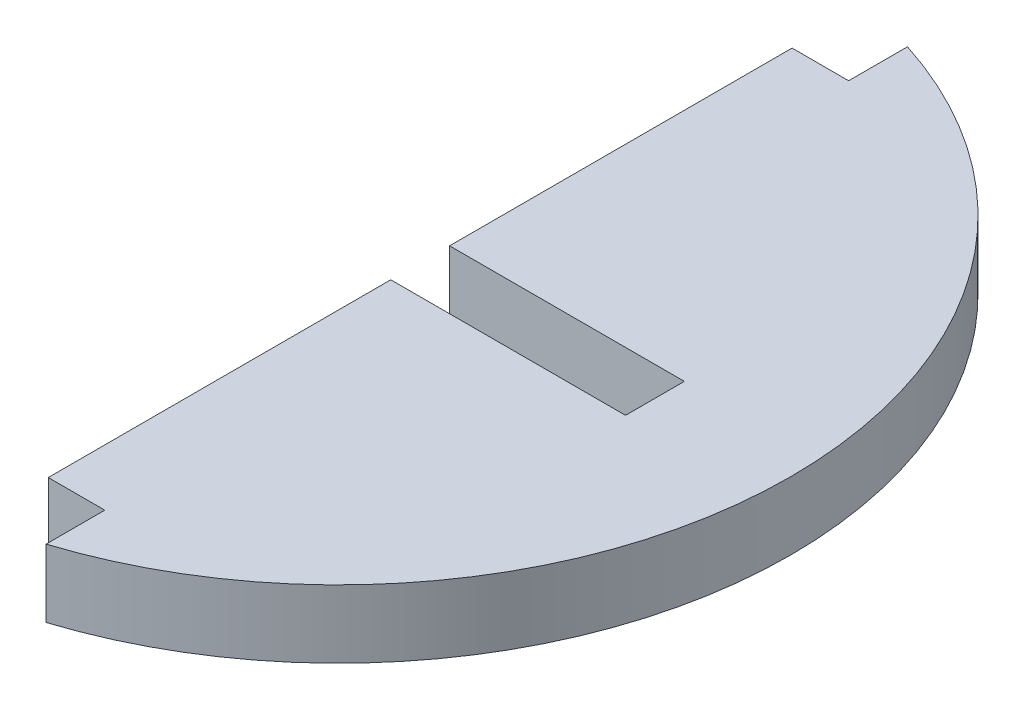
ISO-10303-21;
HEADER;
FILE_DESCRIPTION(('STEP AP214'),'2;1');
FILE_NAME('part.step','',(''),(''),'','','');
FILE_SCHEMA(('AUTOMOTIVE_DESIGN { 1 0 10303 214 1 1 1 1 }'));
ENDSEC;
DATA;
#1=APPLICATION_CONTEXT('core data for automotive mechanical design processes');
#2=APPLICATION_PROTOCOL_DEFINITION('international standard','automotive_design',2000,#1);
#3=PRODUCT_CONTEXT('',#1,'mechanical');
#4=PRODUCT('Part','Part','',(#3));
#5=PRODUCT_RELATED_PRODUCT_CATEGORY('part','',(#4));
#6=PRODUCT_DEFINITION_FORMATION('','',#4);
#7=PRODUCT_DEFINITION_CONTEXT('part definition',#1,'design');
#8=PRODUCT_DEFINITION('design','',#6,#7);
#9=PRODUCT_DEFINITION_SHAPE('','',#8);
#10=(LENGTH_UNIT() NAMED_UNIT(*) SI_UNIT(.MILLI.,.METRE.));
#11=(NAMED_UNIT(*) PLANE_ANGLE_UNIT() SI_UNIT($,.RADIAN.));
#12=(NAMED_UNIT(*) SI_UNIT($,.STERADIAN.) SOLID_ANGLE_UNIT());
#13=UNCERTAINTY_MEASURE_WITH_UNIT(LENGTH_MEASURE(1.E-05),#10,'distance_accuracy_value','');
#14=(GEOMETRIC_REPRESENTATION_CONTEXT(3) GLOBAL_UNCERTAINTY_ASSIGNED_CONTEXT((#13)) GLOBAL_UNIT_ASSIGNED_CONTEXT((#10,
#11,#12)) REPRESENTATION_CONTEXT('',''));
#15=CARTESIAN_POINT('',(0.,0.,0.));
#16=DIRECTION('',(0.,0.,1.));
#17=DIRECTION('',(1.,0.,0.));
#18=AXIS2_PLACEMENT_3D('',#15,#16,#17);
#19=CARTESIAN_POINT('',(14.,-1.5,1.3));
#20=DIRECTION('',(-1.,0.,0.));
#21=DIRECTION('',(0.,0.,1.));
#22=AXIS2_PLACEMENT_3D('',#19,#20,#21);
#23=PLANE('',#22);
#24=DIRECTION('',(0.,1.,0.));
#25=VECTOR('',#24,1.);
#26=CARTESIAN_POINT('',(14.,-1.5,1.3));
#27=LINE('',#26,#25);
#28=CARTESIAN_POINT('',(14.,-1.5,1.3));
#29=VERTEX_POINT('',#28);
#30=CARTESIAN_POINT('',(14.,1.5,1.3));
#31=VERTEX_POINT('',#30);
#32=EDGE_CURVE('E36',#29,#31,#27,.T.);
#33=ORIENTED_EDGE('',*,*,#32,.T.);
#34=DIRECTION('',(0.,0.,1.));
#35=VECTOR('',#34,1.);
#36=CARTESIAN_POINT('',(14.,1.5,1.3));
#37=LINE('',#36,#35);
#38=CARTESIAN_POINT('',(14.,1.5,-1.3));
#39=VERTEX_POINT('',#38);
#40=EDGE_CURVE('E109',#39,#31,#37,.T.);
#41=ORIENTED_EDGE('',*,*,#40,.F.);
#42=DIRECTION('',(0.,1.,0.));
#43=VECTOR('',#42,1.);
#44=CARTESIAN_POINT('',(14.,-1.5,-1.3));
#45=LINE('',#44,#43);
#46=CARTESIAN_POINT('',(14.,-1.5,-1.3));
#47=VERTEX_POINT('',#46);
#48=EDGE_CURVE('E11',#47,#39,#45,.T.);
#49=ORIENTED_EDGE('',*,*,#48,.F.);
#50=DIRECTION('',(0.,0.,1.));
#51=VECTOR('',#50,1.);
#52=CARTESIAN_POINT('',(14.,-1.5,1.3));
#53=LINE('',#52,#51);
#54=EDGE_CURVE('E110',#47,#29,#53,.T.);
#55=ORIENTED_EDGE('',*,*,#54,.T.);
#56=EDGE_LOOP('',(#33,#41,#49,#55));
#57=FACE_BOUND('',#56,.T.);
#58=ADVANCED_FACE('F33',(#57),#23,.T.);
#59=CARTESIAN_POINT('',(14.,-1.5,-1.3));
#60=DIRECTION('',(0.,0.,1.));
#61=DIRECTION('',(1.,0.,0.));
#62=AXIS2_PLACEMENT_3D('',#59,#60,#61);
#63=PLANE('',#62);
#64=ORIENTED_EDGE('',*,*,#48,.T.);
#65=DIRECTION('',(1.,0.,0.));
#66=VECTOR('',#65,1.);
#67=CARTESIAN_POINT('',(14.,1.5,-1.3));
#68=LINE('',#67,#66);
#69=CARTESIAN_POINT('',(3.62132034355964,1.5,-1.30000000000001));
#70=VERTEX_POINT('',#69);
#71=EDGE_CURVE('E127',#70,#39,#68,.T.);
#72=ORIENTED_EDGE('',*,*,#71,.F.);
#73=DIRECTION('',(0.,1.,0.));
#74=VECTOR('',#73,1.);
#75=CARTESIAN_POINT('',(3.62132034355964,-1.5,-1.30000000000001));
#76=LINE('',#75,#74);
#77=CARTESIAN_POINT('',(3.62132034355964,-1.5,-1.30000000000001));
#78=VERTEX_POINT('',#77);
#79=EDGE_CURVE('E41',#78,#70,#76,.T.);
#80=ORIENTED_EDGE('',*,*,#79,.F.);
#81=DIRECTION('',(1.,0.,0.));
#82=VECTOR('',#81,1.);
#83=CARTESIAN_POINT('',(14.,-1.5,-1.3));
#84=LINE('',#83,#82);
#85=EDGE_CURVE('E115',#78,#47,#84,.T.);
#86=ORIENTED_EDGE('',*,*,#85,.T.);
#87=EDGE_LOOP('',(#64,#72,#80,#86));
#88=FACE_BOUND('',#87,.T.);
#89=ADVANCED_FACE('F215',(#88),#63,.T.);
#90=CARTESIAN_POINT('',(3.62132034355965,-1.5,-16.4402058090642));
#91=DIRECTION('',(-1.,0.,0.));
#92=DIRECTION('',(0.,0.,1.));
#93=AXIS2_PLACEMENT_3D('',#90,#91,#92);
#94=PLANE('',#93);
#95=ORIENTED_EDGE('',*,*,#79,.T.);
#96=DIRECTION('',(0.,0.,1.));
#97=VECTOR('',#96,1.);
#98=CARTESIAN_POINT('',(3.62132034355965,1.5,-16.4402058090642));
#99=LINE('',#98,#97);
#100=CARTESIAN_POINT('',(3.62132034355965,1.5,-16.4402058090642));
#101=VERTEX_POINT('',#100);
#102=EDGE_CURVE('E146',#101,#70,#99,.T.);
#103=ORIENTED_EDGE('',*,*,#102,.F.);
#104=DIRECTION('',(0.,1.,0.));
#105=VECTOR('',#104,1.);
#106=CARTESIAN_POINT('',(3.62132034355965,-1.5,-16.4402058090642));
#107=LINE('',#106,#105);
#108=CARTESIAN_POINT('',(3.62132034355965,-1.5,-16.4402058090642));
#109=VERTEX_POINT('',#108);
#110=EDGE_CURVE('E174',#109,#101,#107,.T.);
#111=ORIENTED_EDGE('',*,*,#110,.F.);
#112=DIRECTION('',(0.,0.,1.));
#113=VECTOR('',#112,1.);
#114=CARTESIAN_POINT('',(3.62132034355965,-1.5,-16.4402058090642));
#115=LINE('',#114,#113);
#116=EDGE_CURVE('E170',#109,#78,#115,.T.);
#117=ORIENTED_EDGE('',*,*,#116,.T.);
#118=EDGE_LOOP('',(#95,#103,#111,#117));
#119=FACE_BOUND('',#118,.T.);
#120=ADVANCED_FACE('F213',(#119),#94,.T.);
#121=CARTESIAN_POINT('',(6.12132034355965,-1.5,-16.4402058090642));
#122=DIRECTION('',(0.,0.,-1.));
#123=DIRECTION('',(-1.,0.,0.));
#124=AXIS2_PLACEMENT_3D('',#121,#122,#123);
#125=PLANE('',#124);
#126=ORIENTED_EDGE('',*,*,#110,.T.);
#127=DIRECTION('',(-1.,0.,0.));
#128=VECTOR('',#127,1.);
#129=CARTESIAN_POINT('',(6.12132034355965,1.5,-16.4402058090642));
#130=LINE('',#129,#128);
#131=CARTESIAN_POINT('',(6.12132034355965,1.5,-16.4402058090642));
#132=VERTEX_POINT('',#131);
#133=EDGE_CURVE('E143',#132,#101,#130,.T.);
#134=ORIENTED_EDGE('',*,*,#133,.F.);
#135=DIRECTION('',(0.,1.,0.));
#136=VECTOR('',#135,1.);
#137=CARTESIAN_POINT('',(6.12132034355965,-1.5,-16.4402058090642));
#138=LINE('',#137,#136);
#139=CARTESIAN_POINT('',(6.12132034355965,-1.5,-16.4402058090642));
#140=VERTEX_POINT('',#139);
#141=EDGE_CURVE('E176',#140,#132,#138,.T.);
#142=ORIENTED_EDGE('',*,*,#141,.F.);
#143=DIRECTION('',(-1.,0.,0.));
#144=VECTOR('',#143,1.);
#145=CARTESIAN_POINT('',(6.12132034355965,-1.5,-16.4402058090642));
#146=LINE('',#145,#144);
#147=EDGE_CURVE('E167',#140,#109,#146,.T.);
#148=ORIENTED_EDGE('',*,*,#147,.T.);
#149=EDGE_LOOP('',(#126,#134,#142,#148));
#150=FACE_BOUND('',#149,.T.);
#151=ADVANCED_FACE('F209',(#150),#125,.T.);
#152=CARTESIAN_POINT('',(6.12132034355965,-1.5,-19.0402058090642));
#153=DIRECTION('',(-1.,0.,0.));
#154=DIRECTION('',(0.,0.,1.));
#155=AXIS2_PLACEMENT_3D('',#152,#153,#154);
#156=PLANE('',#155);
#157=ORIENTED_EDGE('',*,*,#141,.T.);
#158=DIRECTION('',(0.,0.,1.));
#159=VECTOR('',#158,1.);
#160=CARTESIAN_POINT('',(6.12132034355965,1.5,-19.0402058090642));
#161=LINE('',#160,#159);
#162=CARTESIAN_POINT('',(6.12132034355965,1.5,-19.0402058090642));
#163=VERTEX_POINT('',#162);
#164=EDGE_CURVE('E140',#163,#132,#161,.T.);
#165=ORIENTED_EDGE('',*,*,#164,.F.);
#166=DIRECTION('',(0.,1.,0.));
#167=VECTOR('',#166,1.);
#168=CARTESIAN_POINT('',(6.12132034355965,-1.5,-19.0402058090642));
#169=LINE('',#168,#167);
#170=CARTESIAN_POINT('',(6.12132034355965,-1.5,-19.0402058090642));
#171=VERTEX_POINT('',#170);
#172=EDGE_CURVE('E178',#171,#163,#169,.T.);
#173=ORIENTED_EDGE('',*,*,#172,.F.);
#174=DIRECTION('',(0.,0.,1.));
#175=VECTOR('',#174,1.);
#176=CARTESIAN_POINT('',(6.12132034355965,-1.5,-19.0402058090642));
#177=LINE('',#176,#175);
#178=EDGE_CURVE('E164',#171,#140,#177,.T.);
#179=ORIENTED_EDGE('',*,*,#178,.T.);
#180=EDGE_LOOP('',(#157,#165,#173,#179));
#181=FACE_BOUND('',#180,.T.);
#182=ADVANCED_FACE('F207',(#181),#156,.T.);
#183=CARTESIAN_POINT('',(0.,-1.5,0.));
#184=DIRECTION('',(0.,1.,0.));
#185=DIRECTION('',(0.,0.,1.));
#186=AXIS2_PLACEMENT_3D('',#183,#184,#185);
#187=CYLINDRICAL_SURFACE('',#186,20.);
#188=ORIENTED_EDGE('',*,*,#172,.T.);
#189=CARTESIAN_POINT('',(0.,1.5,0.));
#190=DIRECTION('',(0.,1.,0.));
#191=DIRECTION('',(0.,0.,1.));
#192=AXIS2_PLACEMENT_3D('',#189,#190,#191);
#193=CIRCLE('',#192,20.);
#194=CARTESIAN_POINT('',(6.12132034355965,1.5,19.0402058090642));
#195=VERTEX_POINT('',#194);
#196=EDGE_CURVE('E137',#195,#163,#193,.T.);
#197=ORIENTED_EDGE('',*,*,#196,.F.);
#198=DIRECTION('',(0.,1.,0.));
#199=VECTOR('',#198,1.);
#200=CARTESIAN_POINT('',(6.12132034355965,-1.5,19.0402058090642));
#201=LINE('',#200,#199);
#202=CARTESIAN_POINT('',(6.12132034355965,-1.5,19.0402058090642));
#203=VERTEX_POINT('',#202);
#204=EDGE_CURVE('E180',#203,#195,#201,.T.);
#205=ORIENTED_EDGE('',*,*,#204,.F.);
#206=CARTESIAN_POINT('',(0.,-1.5,0.));
#207=DIRECTION('',(0.,1.,0.));
#208=DIRECTION('',(0.,0.,1.));
#209=AXIS2_PLACEMENT_3D('',#206,#207,#208);
#210=CIRCLE('',#209,20.);
#211=EDGE_CURVE('E161',#203,#171,#210,.T.);
#212=ORIENTED_EDGE('',*,*,#211,.T.);
#213=EDGE_LOOP('',(#188,#197,#205,#212));
#214=FACE_BOUND('',#213,.T.);
#215=ADVANCED_FACE('F202',(#214),#187,.T.);
#216=CARTESIAN_POINT('',(6.12132034355965,-1.5,19.0402058090642));
#217=DIRECTION('',(-1.,0.,0.));
#218=DIRECTION('',(0.,0.,1.));
#219=AXIS2_PLACEMENT_3D('',#216,#217,#218);
#220=PLANE('',#219);
#221=ORIENTED_EDGE('',*,*,#204,.T.);
#222=DIRECTION('',(0.,0.,1.));
#223=VECTOR('',#222,1.);
#224=CARTESIAN_POINT('',(6.12132034355965,1.5,19.0402058090642));
#225=LINE('',#224,#223);
#226=CARTESIAN_POINT('',(6.12132034355965,1.5,16.4402058090642));
#227=VERTEX_POINT('',#226);
#228=EDGE_CURVE('E134',#227,#195,#225,.T.);
#229=ORIENTED_EDGE('',*,*,#228,.F.);
#230=DIRECTION('',(0.,1.,0.));
#231=VECTOR('',#230,1.);
#232=CARTESIAN_POINT('',(6.12132034355965,-1.5,16.4402058090642));
#233=LINE('',#232,#231);
#234=CARTESIAN_POINT('',(6.12132034355965,-1.5,16.4402058090642));
#235=VERTEX_POINT('',#234);
#236=EDGE_CURVE('E182',#235,#227,#233,.T.);
#237=ORIENTED_EDGE('',*,*,#236,.F.);
#238=DIRECTION('',(0.,0.,1.));
#239=VECTOR('',#238,1.);
#240=CARTESIAN_POINT('',(6.12132034355965,-1.5,19.0402058090642));
#241=LINE('',#240,#239);
#242=EDGE_CURVE('E158',#235,#203,#241,.T.);
#243=ORIENTED_EDGE('',*,*,#242,.T.);
#244=EDGE_LOOP('',(#221,#229,#237,#243));
#245=FACE_BOUND('',#244,.T.);
#246=ADVANCED_FACE('F195',(#245),#220,.T.);
#247=CARTESIAN_POINT('',(6.12132034355965,-1.5,16.4402058090642));
#248=DIRECTION('',(0.,0.,1.));
#249=DIRECTION('',(1.,0.,0.));
#250=AXIS2_PLACEMENT_3D('',#247,#248,#249);
#251=PLANE('',#250);
#252=ORIENTED_EDGE('',*,*,#236,.T.);
#253=DIRECTION('',(1.,0.,0.));
#254=VECTOR('',#253,1.);
#255=CARTESIAN_POINT('',(6.12132034355965,1.5,16.4402058090642));
#256=LINE('',#255,#254);
#257=CARTESIAN_POINT('',(3.62132034355965,1.5,16.4402058090642));
#258=VERTEX_POINT('',#257);
#259=EDGE_CURVE('E131',#258,#227,#256,.T.);
#260=ORIENTED_EDGE('',*,*,#259,.F.);
#261=DIRECTION('',(0.,1.,0.));
#262=VECTOR('',#261,1.);
#263=CARTESIAN_POINT('',(3.62132034355965,-1.5,16.4402058090642));
#264=LINE('',#263,#262);
#265=CARTESIAN_POINT('',(3.62132034355965,-1.5,16.4402058090642));
#266=VERTEX_POINT('',#265);
#267=EDGE_CURVE('E184',#266,#258,#264,.T.);
#268=ORIENTED_EDGE('',*,*,#267,.F.);
#269=DIRECTION('',(1.,0.,0.));
#270=VECTOR('',#269,1.);
#271=CARTESIAN_POINT('',(6.12132034355965,-1.5,16.4402058090642));
#272=LINE('',#271,#270);
#273=EDGE_CURVE('E155',#266,#235,#272,.T.);
#274=ORIENTED_EDGE('',*,*,#273,.T.);
#275=EDGE_LOOP('',(#252,#260,#268,#274));
#276=FACE_BOUND('',#275,.T.);
#277=ADVANCED_FACE('F192',(#276),#251,.T.);
#278=CARTESIAN_POINT('',(3.62132034355965,-1.5,16.4402058090642));
#279=DIRECTION('',(-1.,0.,0.));
#280=DIRECTION('',(0.,0.,1.));
#281=AXIS2_PLACEMENT_3D('',#278,#279,#280);
#282=PLANE('',#281);
#283=ORIENTED_EDGE('',*,*,#267,.T.);
#284=DIRECTION('',(0.,0.,1.));
#285=VECTOR('',#284,1.);
#286=CARTESIAN_POINT('',(3.62132034355965,1.5,16.4402058090642));
#287=LINE('',#286,#285);
#288=CARTESIAN_POINT('',(3.62132034355964,1.5,1.3));
#289=VERTEX_POINT('',#288);
#290=EDGE_CURVE('E122',#289,#258,#287,.T.);
#291=ORIENTED_EDGE('',*,*,#290,.F.);
#292=DIRECTION('',(0.,1.,0.));
#293=VECTOR('',#292,1.);
#294=CARTESIAN_POINT('',(3.62132034355964,-1.5,1.3));
#295=LINE('',#294,#293);
#296=CARTESIAN_POINT('',(3.62132034355964,-1.5,1.3));
#297=VERTEX_POINT('',#296);
#298=EDGE_CURVE('E114',#297,#289,#295,.T.);
#299=ORIENTED_EDGE('',*,*,#298,.F.);
#300=DIRECTION('',(0.,0.,1.));
#301=VECTOR('',#300,1.);
#302=CARTESIAN_POINT('',(3.62132034355965,-1.5,16.4402058090642));
#303=LINE('',#302,#301);
#304=EDGE_CURVE('E152',#297,#266,#303,.T.);
#305=ORIENTED_EDGE('',*,*,#304,.T.);
#306=EDGE_LOOP('',(#283,#291,#299,#305));
#307=FACE_BOUND('',#306,.T.);
#308=ADVANCED_FACE('F186',(#307),#282,.T.);
#309=CARTESIAN_POINT('',(3.62132034355964,-1.5,1.3));
#310=DIRECTION('',(0.,0.,-1.));
#311=DIRECTION('',(-1.,0.,0.));
#312=AXIS2_PLACEMENT_3D('',#309,#310,#311);
#313=PLANE('',#312);
#314=ORIENTED_EDGE('',*,*,#298,.T.);
#315=DIRECTION('',(-1.,0.,0.));
#316=VECTOR('',#315,1.);
#317=CARTESIAN_POINT('',(3.62132034355964,1.5,1.3));
#318=LINE('',#317,#316);
#319=EDGE_CURVE('E117',#31,#289,#318,.T.);
#320=ORIENTED_EDGE('',*,*,#319,.F.);
#321=ORIENTED_EDGE('',*,*,#32,.F.);
#322=DIRECTION('',(-1.,0.,0.));
#323=VECTOR('',#322,1.);
#324=CARTESIAN_POINT('',(3.62132034355964,-1.5,1.3));
#325=LINE('',#324,#323);
#326=EDGE_CURVE('E150',#29,#297,#325,.T.);
#327=ORIENTED_EDGE('',*,*,#326,.T.);
#328=EDGE_LOOP('',(#314,#320,#321,#327));
#329=FACE_BOUND('',#328,.T.);
#330=ADVANCED_FACE('F118',(#329),#313,.T.);
#331=CARTESIAN_POINT('',(0.,-1.5,0.));
#332=DIRECTION('',(0.,1.,0.));
#333=DIRECTION('',(0.,0.,1.));
#334=AXIS2_PLACEMENT_3D('',#331,#332,#333);
#335=PLANE('',#334);
#336=ORIENTED_EDGE('',*,*,#54,.F.);
#337=ORIENTED_EDGE('',*,*,#85,.F.);
#338=ORIENTED_EDGE('',*,*,#116,.F.);
#339=ORIENTED_EDGE('',*,*,#147,.F.);
#340=ORIENTED_EDGE('',*,*,#178,.F.);
#341=ORIENTED_EDGE('',*,*,#211,.F.);
#342=ORIENTED_EDGE('',*,*,#242,.F.);
#343=ORIENTED_EDGE('',*,*,#273,.F.);
#344=ORIENTED_EDGE('',*,*,#304,.F.);
#345=ORIENTED_EDGE('',*,*,#326,.F.);
#346=EDGE_LOOP('',(#336,#337,#338,#339,#340,#341,#342,#343,#344,#345));
#347=FACE_BOUND('',#346,.T.);
#348=ADVANCED_FACE('F198',(#347),#335,.F.);
#349=CARTESIAN_POINT('',(0.,1.5,0.));
#350=DIRECTION('',(0.,1.,0.));
#351=DIRECTION('',(0.,0.,1.));
#352=AXIS2_PLACEMENT_3D('',#349,#350,#351);
#353=PLANE('',#352);
#354=ORIENTED_EDGE('',*,*,#40,.T.);
#355=ORIENTED_EDGE('',*,*,#319,.T.);
#356=ORIENTED_EDGE('',*,*,#290,.T.);
#357=ORIENTED_EDGE('',*,*,#259,.T.);
#358=ORIENTED_EDGE('',*,*,#228,.T.);
#359=ORIENTED_EDGE('',*,*,#196,.T.);
#360=ORIENTED_EDGE('',*,*,#164,.T.);
#361=ORIENTED_EDGE('',*,*,#133,.T.);
#362=ORIENTED_EDGE('',*,*,#102,.T.);
#363=ORIENTED_EDGE('',*,*,#71,.T.);
#364=EDGE_LOOP('',(#354,#355,#356,#357,#358,#359,#360,#361,#362,#363));
#365=FACE_BOUND('',#364,.T.);
#366=ADVANCED_FACE('F125',(#365),#353,.T.);
#367=CLOSED_SHELL('',(#58,#89,#120,#151,#182,#215,#246,#277,#308,#330,#348,#366));
#368=MANIFOLD_SOLID_BREP('B2',#367);
#369=ADVANCED_BREP_SHAPE_REPRESENTATION('',(#18,#368),#14);
#370=SHAPE_DEFINITION_REPRESENTATION(#9,#369);
ENDSEC;
END-ISO-10303-21;
